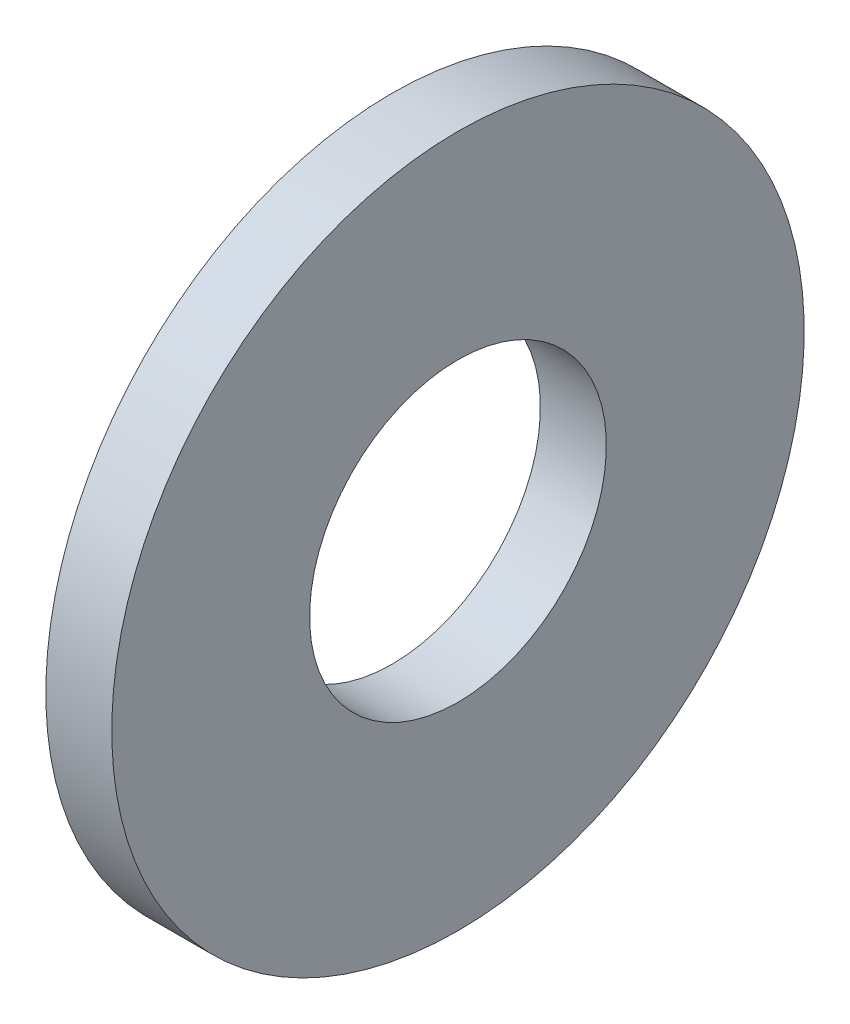
ISO-10303-21;
HEADER;
FILE_DESCRIPTION(('STEP AP214'),'2;1');
FILE_NAME('part.step','',(''),(''),'','','');
FILE_SCHEMA(('AUTOMOTIVE_DESIGN { 1 0 10303 214 1 1 1 1 }'));
ENDSEC;
DATA;
#1=APPLICATION_CONTEXT('core data for automotive mechanical design processes');
#2=APPLICATION_PROTOCOL_DEFINITION('international standard','automotive_design',2000,#1);
#3=PRODUCT_CONTEXT('',#1,'mechanical');
#4=PRODUCT('Part','Part','',(#3));
#5=PRODUCT_RELATED_PRODUCT_CATEGORY('part','',(#4));
#6=PRODUCT_DEFINITION_FORMATION('','',#4);
#7=PRODUCT_DEFINITION_CONTEXT('part definition',#1,'design');
#8=PRODUCT_DEFINITION('design','',#6,#7);
#9=PRODUCT_DEFINITION_SHAPE('','',#8);
#10=(LENGTH_UNIT() NAMED_UNIT(*) SI_UNIT(.MILLI.,.METRE.));
#11=(NAMED_UNIT(*) PLANE_ANGLE_UNIT() SI_UNIT($,.RADIAN.));
#12=(NAMED_UNIT(*) SI_UNIT($,.STERADIAN.) SOLID_ANGLE_UNIT());
#13=UNCERTAINTY_MEASURE_WITH_UNIT(LENGTH_MEASURE(1.E-05),#10,'distance_accuracy_value','');
#14=(GEOMETRIC_REPRESENTATION_CONTEXT(3) GLOBAL_UNCERTAINTY_ASSIGNED_CONTEXT((#13)) GLOBAL_UNIT_ASSIGNED_CONTEXT((#10,
#11,#12)) REPRESENTATION_CONTEXT('',''));
#15=CARTESIAN_POINT('',(0.,0.,0.));
#16=DIRECTION('',(0.,0.,1.));
#17=DIRECTION('',(1.,0.,0.));
#18=AXIS2_PLACEMENT_3D('',#15,#16,#17);
#19=CARTESIAN_POINT('',(0.,0.,0.));
#20=DIRECTION('',(-1.,0.,0.));
#21=DIRECTION('',(0.,0.,1.));
#22=AXIS2_PLACEMENT_3D('',#19,#20,#21);
#23=PLANE('',#22);
#24=CARTESIAN_POINT('',(0.,0.,0.));
#25=DIRECTION('',(1.,0.,0.));
#26=DIRECTION('',(0.,-1.,0.));
#27=AXIS2_PLACEMENT_3D('',#24,#25,#26);
#28=CIRCLE('',#27,4.5);
#29=CARTESIAN_POINT('',(0.,4.5,0.));
#30=VERTEX_POINT('',#29);
#31=EDGE_CURVE('E63',#30,#30,#28,.T.);
#32=ORIENTED_EDGE('',*,*,#31,.T.);
#33=EDGE_LOOP('',(#32));
#34=FACE_BOUND('',#33,.T.);
#35=CARTESIAN_POINT('',(0.,0.,0.));
#36=DIRECTION('',(-1.,0.,0.));
#37=DIRECTION('',(0.,-1.,0.));
#38=AXIS2_PLACEMENT_3D('',#35,#36,#37);
#39=CIRCLE('',#38,10.5);
#40=CARTESIAN_POINT('',(0.,10.5,0.));
#41=VERTEX_POINT('',#40);
#42=EDGE_CURVE('E11',#41,#41,#39,.T.);
#43=ORIENTED_EDGE('',*,*,#42,.T.);
#44=EDGE_LOOP('',(#43));
#45=FACE_BOUND('',#44,.T.);
#46=ADVANCED_FACE('F16',(#34,#45),#23,.T.);
#47=CARTESIAN_POINT('',(2.,0.,0.));
#48=DIRECTION('',(-1.,0.,0.));
#49=DIRECTION('',(0.,0.,1.));
#50=AXIS2_PLACEMENT_3D('',#47,#48,#49);
#51=PLANE('',#50);
#52=CARTESIAN_POINT('',(2.,0.,0.));
#53=DIRECTION('',(-1.,0.,0.));
#54=DIRECTION('',(0.,-1.,0.));
#55=AXIS2_PLACEMENT_3D('',#52,#53,#54);
#56=CIRCLE('',#55,4.5);
#57=CARTESIAN_POINT('',(2.,4.5,0.));
#58=VERTEX_POINT('',#57);
#59=EDGE_CURVE('E52',#58,#58,#56,.T.);
#60=ORIENTED_EDGE('',*,*,#59,.T.);
#61=EDGE_LOOP('',(#60));
#62=FACE_BOUND('',#61,.T.);
#63=CARTESIAN_POINT('',(2.,0.,0.));
#64=DIRECTION('',(-1.,0.,0.));
#65=DIRECTION('',(0.,-1.,0.));
#66=AXIS2_PLACEMENT_3D('',#63,#64,#65);
#67=CIRCLE('',#66,10.5);
#68=CARTESIAN_POINT('',(2.,10.5,0.));
#69=VERTEX_POINT('',#68);
#70=EDGE_CURVE('E56',#69,#69,#67,.T.);
#71=ORIENTED_EDGE('',*,*,#70,.F.);
#72=EDGE_LOOP('',(#71));
#73=FACE_BOUND('',#72,.T.);
#74=ADVANCED_FACE('F53',(#62,#73),#51,.F.);
#75=CARTESIAN_POINT('',(0.,0.,0.));
#76=DIRECTION('',(1.,0.,0.));
#77=DIRECTION('',(0.,-1.,0.));
#78=AXIS2_PLACEMENT_3D('',#75,#76,#77);
#79=CYLINDRICAL_SURFACE('',#78,10.5);
#80=ORIENTED_EDGE('',*,*,#70,.T.);
#81=DIRECTION('',(-1.,0.,0.));
#82=VECTOR('',#81,1.);
#83=CARTESIAN_POINT('',(0.,10.5,0.));
#84=LINE('',#83,#82);
#85=EDGE_CURVE('E26',#69,#41,#84,.T.);
#86=ORIENTED_EDGE('',*,*,#85,.T.);
#87=ORIENTED_EDGE('',*,*,#42,.F.);
#88=ORIENTED_EDGE('',*,*,#85,.F.);
#89=EDGE_LOOP('',(#80,#86,#87,#88));
#90=FACE_BOUND('',#89,.T.);
#91=ADVANCED_FACE('F72',(#90),#79,.T.);
#92=CARTESIAN_POINT('',(0.,0.,0.));
#93=DIRECTION('',(1.,0.,0.));
#94=DIRECTION('',(0.,-1.,0.));
#95=AXIS2_PLACEMENT_3D('',#92,#93,#94);
#96=CYLINDRICAL_SURFACE('',#95,4.5);
#97=ORIENTED_EDGE('',*,*,#31,.F.);
#98=DIRECTION('',(1.,0.,0.));
#99=VECTOR('',#98,1.);
#100=CARTESIAN_POINT('',(0.,4.5,0.));
#101=LINE('',#100,#99);
#102=EDGE_CURVE('E19',#30,#58,#101,.T.);
#103=ORIENTED_EDGE('',*,*,#102,.T.);
#104=ORIENTED_EDGE('',*,*,#59,.F.);
#105=ORIENTED_EDGE('',*,*,#102,.F.);
#106=EDGE_LOOP('',(#97,#103,#104,#105));
#107=FACE_BOUND('',#106,.T.);
#108=ADVANCED_FACE('F70',(#107),#96,.F.);
#109=CLOSED_SHELL('',(#46,#74,#91,#108));
#110=MANIFOLD_SOLID_BREP('B1',#109);
#111=ADVANCED_BREP_SHAPE_REPRESENTATION('',(#18,#110),#14);
#112=SHAPE_DEFINITION_REPRESENTATION(#9,#111);
ENDSEC;
END-ISO-10303-21;
